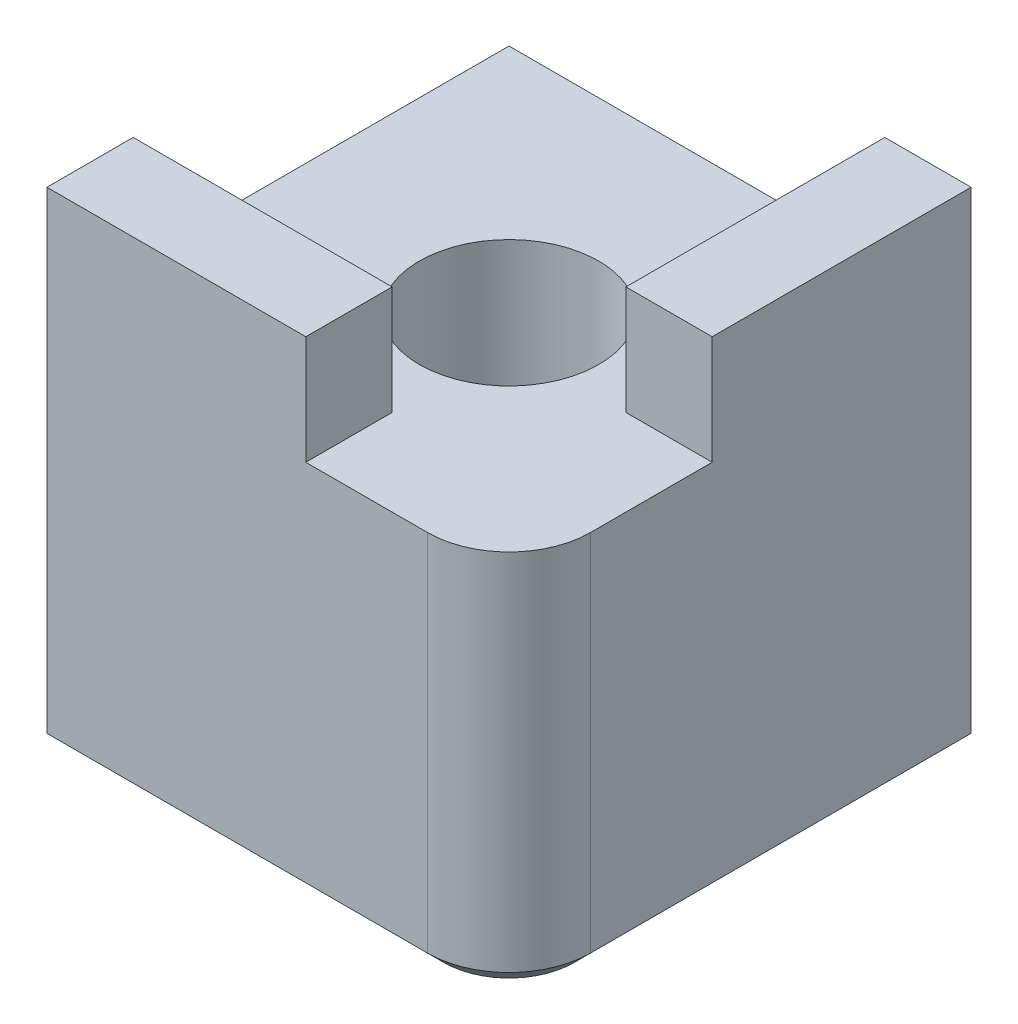
ISO-10303-21;
HEADER;
FILE_DESCRIPTION(('STEP AP214'),'2;1');
FILE_NAME('part.step','',(''),(''),'','','');
FILE_SCHEMA(('AUTOMOTIVE_DESIGN { 1 0 10303 214 1 1 1 1 }'));
ENDSEC;
DATA;
#1=APPLICATION_CONTEXT('core data for automotive mechanical design processes');
#2=APPLICATION_PROTOCOL_DEFINITION('international standard','automotive_design',2000,#1);
#3=PRODUCT_CONTEXT('',#1,'mechanical');
#4=PRODUCT('Part','Part','',(#3));
#5=PRODUCT_RELATED_PRODUCT_CATEGORY('part','',(#4));
#6=PRODUCT_DEFINITION_FORMATION('','',#4);
#7=PRODUCT_DEFINITION_CONTEXT('part definition',#1,'design');
#8=PRODUCT_DEFINITION('design','',#6,#7);
#9=PRODUCT_DEFINITION_SHAPE('','',#8);
#10=(LENGTH_UNIT() NAMED_UNIT(*) SI_UNIT(.MILLI.,.METRE.));
#11=(NAMED_UNIT(*) PLANE_ANGLE_UNIT() SI_UNIT($,.RADIAN.));
#12=(NAMED_UNIT(*) SI_UNIT($,.STERADIAN.) SOLID_ANGLE_UNIT());
#13=UNCERTAINTY_MEASURE_WITH_UNIT(LENGTH_MEASURE(1.E-05),#10,'distance_accuracy_value','');
#14=(GEOMETRIC_REPRESENTATION_CONTEXT(3) GLOBAL_UNCERTAINTY_ASSIGNED_CONTEXT((#13)) GLOBAL_UNIT_ASSIGNED_CONTEXT((#10,
#11,#12)) REPRESENTATION_CONTEXT('',''));
#15=CARTESIAN_POINT('',(0.,0.,0.));
#16=DIRECTION('',(0.,0.,1.));
#17=DIRECTION('',(1.,0.,0.));
#18=AXIS2_PLACEMENT_3D('',#15,#16,#17);
#19=CARTESIAN_POINT('',(0.,-1.5,0.));
#20=DIRECTION('',(0.,1.,0.));
#21=DIRECTION('',(0.,0.,1.));
#22=AXIS2_PLACEMENT_3D('',#19,#20,#21);
#23=PLANE('',#22);
#24=CARTESIAN_POINT('',(0.,-1.5,0.));
#25=DIRECTION('',(0.,1.,0.));
#26=DIRECTION('',(0.,0.,1.));
#27=AXIS2_PLACEMENT_3D('',#24,#25,#26);
#28=CIRCLE('',#27,1.65);
#29=CARTESIAN_POINT('',(0.,-1.5,1.65));
#30=VERTEX_POINT('',#29);
#31=EDGE_CURVE('E242',#30,#30,#28,.T.);
#32=ORIENTED_EDGE('',*,*,#31,.F.);
#33=EDGE_LOOP('',(#32));
#34=FACE_BOUND('',#33,.T.);
#35=DIRECTION('',(-1.,0.,0.));
#36=VECTOR('',#35,1.);
#37=CARTESIAN_POINT('',(-4.25,-1.5,2.6625));
#38=LINE('',#37,#36);
#39=CARTESIAN_POINT('',(0.512500000000001,-1.5,2.6625));
#40=VERTEX_POINT('',#39);
#41=CARTESIAN_POINT('',(-4.25,-1.5,2.6625));
#42=VERTEX_POINT('',#41);
#43=EDGE_CURVE('E191',#40,#42,#38,.T.);
#44=ORIENTED_EDGE('',*,*,#43,.F.);
#45=DIRECTION('',(0.,0.,-1.));
#46=VECTOR('',#45,1.);
#47=CARTESIAN_POINT('',(0.512500000000001,-1.5,4.25));
#48=LINE('',#47,#46);
#49=CARTESIAN_POINT('',(0.512500000000001,-1.5,4.25));
#50=VERTEX_POINT('',#49);
#51=EDGE_CURVE('E194',#50,#40,#48,.T.);
#52=ORIENTED_EDGE('',*,*,#51,.F.);
#53=DIRECTION('',(1.,0.,0.));
#54=VECTOR('',#53,1.);
#55=CARTESIAN_POINT('',(-4.25,-1.5,4.25));
#56=LINE('',#55,#54);
#57=CARTESIAN_POINT('',(2.75,-1.5,4.25));
#58=VERTEX_POINT('',#57);
#59=EDGE_CURVE('E250',#50,#58,#56,.T.);
#60=ORIENTED_EDGE('',*,*,#59,.T.);
#61=CARTESIAN_POINT('',(2.75,-1.5,2.75));
#62=DIRECTION('',(0.,1.,0.));
#63=DIRECTION('',(0.,0.,1.));
#64=AXIS2_PLACEMENT_3D('',#61,#62,#63);
#65=CIRCLE('',#64,1.5);
#66=CARTESIAN_POINT('',(4.25,-1.5,2.75));
#67=VERTEX_POINT('',#66);
#68=EDGE_CURVE('E238',#67,#58,#65,.F.);
#69=ORIENTED_EDGE('',*,*,#68,.F.);
#70=DIRECTION('',(0.,0.,1.));
#71=VECTOR('',#70,1.);
#72=CARTESIAN_POINT('',(4.25,-1.5,-4.25));
#73=LINE('',#72,#71);
#74=CARTESIAN_POINT('',(4.25,-1.5,0.512500000000001));
#75=VERTEX_POINT('',#74);
#76=EDGE_CURVE('E253',#75,#67,#73,.T.);
#77=ORIENTED_EDGE('',*,*,#76,.F.);
#78=DIRECTION('',(1.,0.,0.));
#79=VECTOR('',#78,1.);
#80=CARTESIAN_POINT('',(4.25,-1.5,0.512500000000001));
#81=LINE('',#80,#79);
#82=CARTESIAN_POINT('',(2.6625,-1.5,0.512500000000001));
#83=VERTEX_POINT('',#82);
#84=EDGE_CURVE('E213',#83,#75,#81,.T.);
#85=ORIENTED_EDGE('',*,*,#84,.F.);
#86=DIRECTION('',(0.,0.,1.));
#87=VECTOR('',#86,1.);
#88=CARTESIAN_POINT('',(2.6625,-1.5,-4.25));
#89=LINE('',#88,#87);
#90=CARTESIAN_POINT('',(2.6625,-1.5,-4.25));
#91=VERTEX_POINT('',#90);
#92=EDGE_CURVE('E74',#91,#83,#89,.T.);
#93=ORIENTED_EDGE('',*,*,#92,.F.);
#94=DIRECTION('',(-1.,0.,0.));
#95=VECTOR('',#94,1.);
#96=CARTESIAN_POINT('',(-4.25,-1.5,-4.25));
#97=LINE('',#96,#95);
#98=CARTESIAN_POINT('',(-4.25,-1.5,-4.25));
#99=VERTEX_POINT('',#98);
#100=EDGE_CURVE('E260',#91,#99,#97,.T.);
#101=ORIENTED_EDGE('',*,*,#100,.T.);
#102=DIRECTION('',(0.,0.,1.));
#103=VECTOR('',#102,1.);
#104=CARTESIAN_POINT('',(-4.25,-1.5,-4.25));
#105=LINE('',#104,#103);
#106=EDGE_CURVE('E256',#99,#42,#105,.T.);
#107=ORIENTED_EDGE('',*,*,#106,.T.);
#108=EDGE_LOOP('',(#44,#52,#60,#69,#77,#85,#93,#101,#107));
#109=FACE_BOUND('',#108,.T.);
#110=ADVANCED_FACE('F42',(#34,#109),#23,.T.);
#111=CARTESIAN_POINT('',(-4.25,-8.5,4.25));
#112=DIRECTION('',(0.,0.,1.));
#113=DIRECTION('',(1.,0.,0.));
#114=AXIS2_PLACEMENT_3D('',#111,#112,#113);
#115=PLANE('',#114);
#116=DIRECTION('',(0.,1.,0.));
#117=VECTOR('',#116,1.);
#118=CARTESIAN_POINT('',(-4.25,-8.5,4.25));
#119=LINE('',#118,#117);
#120=CARTESIAN_POINT('',(-4.25,-8.2,4.25));
#121=VERTEX_POINT('',#120);
#122=CARTESIAN_POINT('',(-4.25,0.5,4.25));
#123=VERTEX_POINT('',#122);
#124=EDGE_CURVE('E165',#121,#123,#119,.T.);
#125=ORIENTED_EDGE('',*,*,#124,.F.);
#126=DIRECTION('',(1.,0.,0.));
#127=VECTOR('',#126,1.);
#128=CARTESIAN_POINT('',(-4.25,-8.2,4.25));
#129=LINE('',#128,#127);
#130=CARTESIAN_POINT('',(2.75,-8.2,4.25));
#131=VERTEX_POINT('',#130);
#132=EDGE_CURVE('E52',#121,#131,#129,.T.);
#133=ORIENTED_EDGE('',*,*,#132,.T.);
#134=DIRECTION('',(0.,1.,0.));
#135=VECTOR('',#134,1.);
#136=CARTESIAN_POINT('',(2.75,-8.5,4.25));
#137=LINE('',#136,#135);
#138=EDGE_CURVE('E175',#131,#58,#137,.T.);
#139=ORIENTED_EDGE('',*,*,#138,.T.);
#140=ORIENTED_EDGE('',*,*,#59,.F.);
#141=DIRECTION('',(0.,-1.,0.));
#142=VECTOR('',#141,1.);
#143=CARTESIAN_POINT('',(0.512500000000001,0.5,4.25));
#144=LINE('',#143,#142);
#145=CARTESIAN_POINT('',(0.512500000000001,0.5,4.25));
#146=VERTEX_POINT('',#145);
#147=EDGE_CURVE('E182',#146,#50,#144,.T.);
#148=ORIENTED_EDGE('',*,*,#147,.F.);
#149=DIRECTION('',(1.,0.,0.));
#150=VECTOR('',#149,1.);
#151=CARTESIAN_POINT('',(-4.25,0.5,4.25));
#152=LINE('',#151,#150);
#153=EDGE_CURVE('E179',#123,#146,#152,.T.);
#154=ORIENTED_EDGE('',*,*,#153,.F.);
#155=EDGE_LOOP('',(#125,#133,#139,#140,#148,#154));
#156=FACE_BOUND('',#155,.T.);
#157=ADVANCED_FACE('F180',(#156),#115,.T.);
#158=CARTESIAN_POINT('',(4.25,-8.5,4.25));
#159=DIRECTION('',(1.,0.,0.));
#160=DIRECTION('',(0.,0.,-1.));
#161=AXIS2_PLACEMENT_3D('',#158,#159,#160);
#162=PLANE('',#161);
#163=DIRECTION('',(0.,1.,0.));
#164=VECTOR('',#163,1.);
#165=CARTESIAN_POINT('',(4.25,-8.5,2.75));
#166=LINE('',#165,#164);
#167=CARTESIAN_POINT('',(4.25,-8.2,2.75));
#168=VERTEX_POINT('',#167);
#169=EDGE_CURVE('E272',#67,#168,#166,.F.);
#170=ORIENTED_EDGE('',*,*,#169,.T.);
#171=DIRECTION('',(0.,0.,-1.));
#172=VECTOR('',#171,1.);
#173=CARTESIAN_POINT('',(4.25,-8.2,4.25));
#174=LINE('',#173,#172);
#175=CARTESIAN_POINT('',(4.25,-8.2,-4.25));
#176=VERTEX_POINT('',#175);
#177=EDGE_CURVE('E297',#168,#176,#174,.T.);
#178=ORIENTED_EDGE('',*,*,#177,.T.);
#179=DIRECTION('',(0.,1.,0.));
#180=VECTOR('',#179,1.);
#181=CARTESIAN_POINT('',(4.25,-8.5,-4.25));
#182=LINE('',#181,#180);
#183=CARTESIAN_POINT('',(4.25,0.5,-4.25));
#184=VERTEX_POINT('',#183);
#185=EDGE_CURVE('E262',#176,#184,#182,.T.);
#186=ORIENTED_EDGE('',*,*,#185,.T.);
#187=DIRECTION('',(0.,0.,-1.));
#188=VECTOR('',#187,1.);
#189=CARTESIAN_POINT('',(4.25,0.5,-4.25));
#190=LINE('',#189,#188);
#191=CARTESIAN_POINT('',(4.25,0.5,0.512500000000001));
#192=VERTEX_POINT('',#191);
#193=EDGE_CURVE('E209',#192,#184,#190,.T.);
#194=ORIENTED_EDGE('',*,*,#193,.F.);
#195=DIRECTION('',(0.,-1.,0.));
#196=VECTOR('',#195,1.);
#197=CARTESIAN_POINT('',(4.25,0.5,0.512500000000001));
#198=LINE('',#197,#196);
#199=EDGE_CURVE('E221',#192,#75,#198,.T.);
#200=ORIENTED_EDGE('',*,*,#199,.T.);
#201=ORIENTED_EDGE('',*,*,#76,.T.);
#202=EDGE_LOOP('',(#170,#178,#186,#194,#200,#201));
#203=FACE_BOUND('',#202,.T.);
#204=ADVANCED_FACE('F329',(#203),#162,.T.);
#205=CARTESIAN_POINT('',(2.75,-8.5,2.75));
#206=DIRECTION('',(0.,1.,0.));
#207=DIRECTION('',(0.,0.,1.));
#208=AXIS2_PLACEMENT_3D('',#205,#206,#207);
#209=CYLINDRICAL_SURFACE('',#208,1.5);
#210=ORIENTED_EDGE('',*,*,#138,.F.);
#211=CARTESIAN_POINT('',(2.75,-8.2,2.75));
#212=DIRECTION('',(0.,-1.,0.));
#213=DIRECTION('',(0.,0.,-1.));
#214=AXIS2_PLACEMENT_3D('',#211,#212,#213);
#215=CIRCLE('',#214,1.5);
#216=EDGE_CURVE('E11',#131,#168,#215,.F.);
#217=ORIENTED_EDGE('',*,*,#216,.T.);
#218=ORIENTED_EDGE('',*,*,#169,.F.);
#219=ORIENTED_EDGE('',*,*,#68,.T.);
#220=EDGE_LOOP('',(#210,#217,#218,#219));
#221=FACE_BOUND('',#220,.T.);
#222=ADVANCED_FACE('F377',(#221),#209,.T.);
#223=CARTESIAN_POINT('',(-4.25,-8.5,4.25));
#224=DIRECTION('',(-1.,0.,0.));
#225=DIRECTION('',(0.,0.,1.));
#226=AXIS2_PLACEMENT_3D('',#223,#224,#225);
#227=PLANE('',#226);
#228=DIRECTION('',(0.,1.,0.));
#229=VECTOR('',#228,1.);
#230=CARTESIAN_POINT('',(-4.25,-8.5,-4.25));
#231=LINE('',#230,#229);
#232=CARTESIAN_POINT('',(-4.25,-8.2,-4.25));
#233=VERTEX_POINT('',#232);
#234=EDGE_CURVE('E176',#233,#99,#231,.T.);
#235=ORIENTED_EDGE('',*,*,#234,.F.);
#236=DIRECTION('',(0.,0.,1.));
#237=VECTOR('',#236,1.);
#238=CARTESIAN_POINT('',(-4.25,-8.2,4.25));
#239=LINE('',#238,#237);
#240=EDGE_CURVE('E173',#233,#121,#239,.T.);
#241=ORIENTED_EDGE('',*,*,#240,.T.);
#242=ORIENTED_EDGE('',*,*,#124,.T.);
#243=DIRECTION('',(0.,0.,1.));
#244=VECTOR('',#243,1.);
#245=CARTESIAN_POINT('',(-4.25,0.5,4.25));
#246=LINE('',#245,#244);
#247=CARTESIAN_POINT('',(-4.25,0.5,2.6625));
#248=VERTEX_POINT('',#247);
#249=EDGE_CURVE('E171',#248,#123,#246,.T.);
#250=ORIENTED_EDGE('',*,*,#249,.F.);
#251=DIRECTION('',(0.,-1.,0.));
#252=VECTOR('',#251,1.);
#253=CARTESIAN_POINT('',(-4.25,0.5,2.6625));
#254=LINE('',#253,#252);
#255=EDGE_CURVE('E201',#248,#42,#254,.T.);
#256=ORIENTED_EDGE('',*,*,#255,.T.);
#257=ORIENTED_EDGE('',*,*,#106,.F.);
#258=EDGE_LOOP('',(#235,#241,#242,#250,#256,#257));
#259=FACE_BOUND('',#258,.T.);
#260=ADVANCED_FACE('F168',(#259),#227,.T.);
#261=CARTESIAN_POINT('',(-4.25,-8.5,-4.25));
#262=DIRECTION('',(0.,0.,-1.));
#263=DIRECTION('',(-1.,0.,0.));
#264=AXIS2_PLACEMENT_3D('',#261,#262,#263);
#265=PLANE('',#264);
#266=ORIENTED_EDGE('',*,*,#185,.F.);
#267=DIRECTION('',(-1.,0.,0.));
#268=VECTOR('',#267,1.);
#269=CARTESIAN_POINT('',(-4.25,-8.2,-4.25));
#270=LINE('',#269,#268);
#271=EDGE_CURVE('E294',#176,#233,#270,.T.);
#272=ORIENTED_EDGE('',*,*,#271,.T.);
#273=ORIENTED_EDGE('',*,*,#234,.T.);
#274=ORIENTED_EDGE('',*,*,#100,.F.);
#275=DIRECTION('',(0.,-1.,0.));
#276=VECTOR('',#275,1.);
#277=CARTESIAN_POINT('',(2.6625,0.5,-4.25));
#278=LINE('',#277,#276);
#279=CARTESIAN_POINT('',(2.6625,0.5,-4.25));
#280=VERTEX_POINT('',#279);
#281=EDGE_CURVE('E233',#280,#91,#278,.T.);
#282=ORIENTED_EDGE('',*,*,#281,.F.);
#283=DIRECTION('',(-1.,0.,0.));
#284=VECTOR('',#283,1.);
#285=CARTESIAN_POINT('',(4.25,0.5,-4.25));
#286=LINE('',#285,#284);
#287=EDGE_CURVE('E212',#184,#280,#286,.T.);
#288=ORIENTED_EDGE('',*,*,#287,.F.);
#289=EDGE_LOOP('',(#266,#272,#273,#274,#282,#288));
#290=FACE_BOUND('',#289,.T.);
#291=ADVANCED_FACE('F334',(#290),#265,.T.);
#292=CARTESIAN_POINT('',(0.,-8.5,0.));
#293=DIRECTION('',(0.,-1.,0.));
#294=DIRECTION('',(0.,0.,-1.));
#295=AXIS2_PLACEMENT_3D('',#292,#293,#294);
#296=PLANE('',#295);
#297=DIRECTION('',(-1.,0.,0.));
#298=VECTOR('',#297,1.);
#299=CARTESIAN_POINT('',(0.,-8.5,3.95));
#300=LINE('',#299,#298);
#301=CARTESIAN_POINT('',(2.75,-8.5,3.95));
#302=VERTEX_POINT('',#301);
#303=CARTESIAN_POINT('',(-3.95,-8.5,3.95));
#304=VERTEX_POINT('',#303);
#305=EDGE_CURVE('E281',#302,#304,#300,.T.);
#306=ORIENTED_EDGE('',*,*,#305,.T.);
#307=DIRECTION('',(0.,0.,-1.));
#308=VECTOR('',#307,1.);
#309=CARTESIAN_POINT('',(-3.95,-8.5,0.));
#310=LINE('',#309,#308);
#311=CARTESIAN_POINT('',(-3.95,-8.5,-3.95));
#312=VERTEX_POINT('',#311);
#313=EDGE_CURVE('E290',#304,#312,#310,.T.);
#314=ORIENTED_EDGE('',*,*,#313,.T.);
#315=DIRECTION('',(1.,0.,0.));
#316=VECTOR('',#315,1.);
#317=CARTESIAN_POINT('',(0.,-8.5,-3.95));
#318=LINE('',#317,#316);
#319=CARTESIAN_POINT('',(3.95,-8.5,-3.95));
#320=VERTEX_POINT('',#319);
#321=EDGE_CURVE('E287',#312,#320,#318,.T.);
#322=ORIENTED_EDGE('',*,*,#321,.T.);
#323=DIRECTION('',(0.,0.,1.));
#324=VECTOR('',#323,1.);
#325=CARTESIAN_POINT('',(3.95,-8.5,0.));
#326=LINE('',#325,#324);
#327=CARTESIAN_POINT('',(3.95,-8.5,2.75));
#328=VERTEX_POINT('',#327);
#329=EDGE_CURVE('E284',#320,#328,#326,.T.);
#330=ORIENTED_EDGE('',*,*,#329,.T.);
#331=CARTESIAN_POINT('',(2.75,-8.5,2.75));
#332=DIRECTION('',(0.,-1.,0.));
#333=DIRECTION('',(0.,0.,-1.));
#334=AXIS2_PLACEMENT_3D('',#331,#332,#333);
#335=CIRCLE('',#334,1.2);
#336=EDGE_CURVE('E278',#328,#302,#335,.T.);
#337=ORIENTED_EDGE('',*,*,#336,.T.);
#338=EDGE_LOOP('',(#306,#314,#322,#330,#337));
#339=FACE_BOUND('',#338,.T.);
#340=ADVANCED_FACE('F371',(#339),#296,.T.);
#341=CARTESIAN_POINT('',(0.,-6.5,0.));
#342=DIRECTION('',(0.,1.,0.));
#343=DIRECTION('',(0.,0.,1.));
#344=AXIS2_PLACEMENT_3D('',#341,#342,#343);
#345=CONICAL_SURFACE('',#344,1.65,1.02974425867665);
#346=CARTESIAN_POINT('',(0.,-7.49142002139547,0.));
#347=VERTEX_POINT('',#346);
#348=VERTEX_LOOP('',#347);
#349=FACE_BOUND('',#348,.T.);
#350=CARTESIAN_POINT('',(0.,-6.5,0.));
#351=DIRECTION('',(0.,1.,0.));
#352=DIRECTION('',(0.,0.,1.));
#353=AXIS2_PLACEMENT_3D('',#350,#351,#352);
#354=CIRCLE('',#353,1.65);
#355=CARTESIAN_POINT('',(0.,-6.5,1.65));
#356=VERTEX_POINT('',#355);
#357=EDGE_CURVE('E246',#356,#356,#354,.T.);
#358=ORIENTED_EDGE('',*,*,#357,.T.);
#359=EDGE_LOOP('',(#358));
#360=FACE_BOUND('',#359,.T.);
#361=ADVANCED_FACE('F370',(#349,#360),#345,.F.);
#362=CARTESIAN_POINT('',(0.,-1.5,0.));
#363=DIRECTION('',(0.,1.,0.));
#364=DIRECTION('',(0.,0.,1.));
#365=AXIS2_PLACEMENT_3D('',#362,#363,#364);
#366=CYLINDRICAL_SURFACE('',#365,1.65);
#367=ORIENTED_EDGE('',*,*,#357,.F.);
#368=EDGE_LOOP('',(#367));
#369=FACE_BOUND('',#368,.T.);
#370=ORIENTED_EDGE('',*,*,#31,.T.);
#371=EDGE_LOOP('',(#370));
#372=FACE_BOUND('',#371,.T.);
#373=ADVANCED_FACE('F394',(#369,#372),#366,.F.);
#374=CARTESIAN_POINT('',(4.25,-8.2,4.25));
#375=DIRECTION('',(-0.707106781186548,0.707106781186546,0.));
#376=DIRECTION('',(0.,0.,-1.));
#377=AXIS2_PLACEMENT_3D('',#374,#375,#376);
#378=PLANE('',#377);
#379=DIRECTION('',(0.577350269189623,0.577350269189624,-0.577350269189631));
#380=VECTOR('',#379,1.);
#381=CARTESIAN_POINT('',(1.41666666666666,-11.0333333333334,-1.41666666666662));
#382=LINE('',#381,#380);
#383=EDGE_CURVE('E309',#176,#320,#382,.F.);
#384=ORIENTED_EDGE('',*,*,#383,.F.);
#385=ORIENTED_EDGE('',*,*,#177,.F.);
#386=DIRECTION('',(0.707106781186546,0.707106781186548,0.));
#387=VECTOR('',#386,1.);
#388=CARTESIAN_POINT('',(3.95,-8.5,2.75));
#389=LINE('',#388,#387);
#390=EDGE_CURVE('E46',#328,#168,#389,.T.);
#391=ORIENTED_EDGE('',*,*,#390,.F.);
#392=ORIENTED_EDGE('',*,*,#329,.F.);
#393=EDGE_LOOP('',(#384,#385,#391,#392));
#394=FACE_BOUND('',#393,.T.);
#395=ADVANCED_FACE('F44',(#394),#378,.F.);
#396=CARTESIAN_POINT('',(2.75,-8.5,2.75));
#397=DIRECTION('',(0.,1.,0.));
#398=DIRECTION('',(0.,0.,1.));
#399=AXIS2_PLACEMENT_3D('',#396,#397,#398);
#400=CONICAL_SURFACE('',#399,1.2,0.785398163397448);
#401=ORIENTED_EDGE('',*,*,#390,.T.);
#402=ORIENTED_EDGE('',*,*,#216,.F.);
#403=DIRECTION('',(0.,0.707106781186548,0.707106781186546));
#404=VECTOR('',#403,1.);
#405=CARTESIAN_POINT('',(2.75,-8.5,3.95));
#406=LINE('',#405,#404);
#407=EDGE_CURVE('E306',#302,#131,#406,.T.);
#408=ORIENTED_EDGE('',*,*,#407,.F.);
#409=ORIENTED_EDGE('',*,*,#336,.F.);
#410=EDGE_LOOP('',(#401,#402,#408,#409));
#411=FACE_BOUND('',#410,.T.);
#412=ADVANCED_FACE('F322',(#411),#400,.T.);
#413=CARTESIAN_POINT('',(-4.25,-8.2,-4.25));
#414=DIRECTION('',(0.,0.707106781186552,0.707106781186544));
#415=DIRECTION('',(-1.,0.,0.));
#416=AXIS2_PLACEMENT_3D('',#413,#414,#415);
#417=PLANE('',#416);
#418=ORIENTED_EDGE('',*,*,#383,.T.);
#419=ORIENTED_EDGE('',*,*,#321,.F.);
#420=DIRECTION('',(-0.577350269189628,0.577350269189621,-0.577350269189628));
#421=VECTOR('',#420,1.);
#422=CARTESIAN_POINT('',(-4.25,-8.2,-4.25));
#423=LINE('',#422,#421);
#424=EDGE_CURVE('E303',#233,#312,#423,.F.);
#425=ORIENTED_EDGE('',*,*,#424,.F.);
#426=ORIENTED_EDGE('',*,*,#271,.F.);
#427=EDGE_LOOP('',(#418,#419,#425,#426));
#428=FACE_BOUND('',#427,.T.);
#429=ADVANCED_FACE('F387',(#428),#417,.F.);
#430=CARTESIAN_POINT('',(-4.25,-8.2,4.25));
#431=DIRECTION('',(0.,0.707106781186546,-0.707106781186548));
#432=DIRECTION('',(1.,0.,0.));
#433=AXIS2_PLACEMENT_3D('',#430,#431,#432);
#434=PLANE('',#433);
#435=ORIENTED_EDGE('',*,*,#407,.T.);
#436=ORIENTED_EDGE('',*,*,#132,.F.);
#437=DIRECTION('',(0.577350269189631,-0.577350269189624,-0.577350269189623));
#438=VECTOR('',#437,1.);
#439=CARTESIAN_POINT('',(-4.25,-8.2,4.25));
#440=LINE('',#439,#438);
#441=EDGE_CURVE('E237',#304,#121,#440,.F.);
#442=ORIENTED_EDGE('',*,*,#441,.F.);
#443=ORIENTED_EDGE('',*,*,#305,.F.);
#444=EDGE_LOOP('',(#435,#436,#442,#443));
#445=FACE_BOUND('',#444,.T.);
#446=ADVANCED_FACE('F356',(#445),#434,.F.);
#447=CARTESIAN_POINT('',(-4.25,-8.2,4.25));
#448=DIRECTION('',(0.707106781186544,0.707106781186552,0.));
#449=DIRECTION('',(0.,0.,1.));
#450=AXIS2_PLACEMENT_3D('',#447,#448,#449);
#451=PLANE('',#450);
#452=ORIENTED_EDGE('',*,*,#424,.T.);
#453=ORIENTED_EDGE('',*,*,#313,.F.);
#454=ORIENTED_EDGE('',*,*,#441,.T.);
#455=ORIENTED_EDGE('',*,*,#240,.F.);
#456=EDGE_LOOP('',(#452,#453,#454,#455));
#457=FACE_BOUND('',#456,.T.);
#458=ADVANCED_FACE('F349',(#457),#451,.F.);
#459=CARTESIAN_POINT('',(2.6625,0.5,-4.25));
#460=DIRECTION('',(1.,0.,0.));
#461=DIRECTION('',(0.,0.,-1.));
#462=AXIS2_PLACEMENT_3D('',#459,#460,#461);
#463=PLANE('',#462);
#464=ORIENTED_EDGE('',*,*,#92,.T.);
#465=DIRECTION('',(0.,-1.,0.));
#466=VECTOR('',#465,1.);
#467=CARTESIAN_POINT('',(2.6625,0.5,0.512500000000001));
#468=LINE('',#467,#466);
#469=CARTESIAN_POINT('',(2.6625,0.5,0.512500000000001));
#470=VERTEX_POINT('',#469);
#471=EDGE_CURVE('E229',#470,#83,#468,.T.);
#472=ORIENTED_EDGE('',*,*,#471,.F.);
#473=DIRECTION('',(0.,0.,1.));
#474=VECTOR('',#473,1.);
#475=CARTESIAN_POINT('',(2.6625,0.5,-4.25));
#476=LINE('',#475,#474);
#477=EDGE_CURVE('E215',#280,#470,#476,.T.);
#478=ORIENTED_EDGE('',*,*,#477,.F.);
#479=ORIENTED_EDGE('',*,*,#281,.T.);
#480=EDGE_LOOP('',(#464,#472,#478,#479));
#481=FACE_BOUND('',#480,.T.);
#482=ADVANCED_FACE('F347',(#481),#463,.F.);
#483=CARTESIAN_POINT('',(4.25,0.5,0.512500000000001));
#484=DIRECTION('',(0.,0.,-1.));
#485=DIRECTION('',(-1.,0.,0.));
#486=AXIS2_PLACEMENT_3D('',#483,#484,#485);
#487=PLANE('',#486);
#488=ORIENTED_EDGE('',*,*,#84,.T.);
#489=ORIENTED_EDGE('',*,*,#199,.F.);
#490=DIRECTION('',(1.,0.,0.));
#491=VECTOR('',#490,1.);
#492=CARTESIAN_POINT('',(4.25,0.5,0.512500000000001));
#493=LINE('',#492,#491);
#494=EDGE_CURVE('E218',#470,#192,#493,.T.);
#495=ORIENTED_EDGE('',*,*,#494,.F.);
#496=ORIENTED_EDGE('',*,*,#471,.T.);
#497=EDGE_LOOP('',(#488,#489,#495,#496));
#498=FACE_BOUND('',#497,.T.);
#499=ADVANCED_FACE('F343',(#498),#487,.F.);
#500=CARTESIAN_POINT('',(0.,0.5,0.));
#501=DIRECTION('',(0.,-1.,0.));
#502=DIRECTION('',(0.,0.,-1.));
#503=AXIS2_PLACEMENT_3D('',#500,#501,#502);
#504=PLANE('',#503);
#505=ORIENTED_EDGE('',*,*,#193,.T.);
#506=ORIENTED_EDGE('',*,*,#287,.T.);
#507=ORIENTED_EDGE('',*,*,#477,.T.);
#508=ORIENTED_EDGE('',*,*,#494,.T.);
#509=EDGE_LOOP('',(#505,#506,#507,#508));
#510=FACE_BOUND('',#509,.T.);
#511=ADVANCED_FACE('F338',(#510),#504,.F.);
#512=CARTESIAN_POINT('',(0.512500000000001,0.5,4.25));
#513=DIRECTION('',(-1.,0.,0.));
#514=DIRECTION('',(0.,0.,1.));
#515=AXIS2_PLACEMENT_3D('',#512,#513,#514);
#516=PLANE('',#515);
#517=ORIENTED_EDGE('',*,*,#51,.T.);
#518=DIRECTION('',(0.,-1.,0.));
#519=VECTOR('',#518,1.);
#520=CARTESIAN_POINT('',(0.512500000000001,0.5,2.6625));
#521=LINE('',#520,#519);
#522=CARTESIAN_POINT('',(0.512500000000001,0.5,2.6625));
#523=VERTEX_POINT('',#522);
#524=EDGE_CURVE('E63',#523,#40,#521,.T.);
#525=ORIENTED_EDGE('',*,*,#524,.F.);
#526=DIRECTION('',(0.,0.,-1.));
#527=VECTOR('',#526,1.);
#528=CARTESIAN_POINT('',(0.512500000000001,0.5,4.25));
#529=LINE('',#528,#527);
#530=EDGE_CURVE('E186',#146,#523,#529,.T.);
#531=ORIENTED_EDGE('',*,*,#530,.F.);
#532=ORIENTED_EDGE('',*,*,#147,.T.);
#533=EDGE_LOOP('',(#517,#525,#531,#532));
#534=FACE_BOUND('',#533,.T.);
#535=ADVANCED_FACE('F530',(#534),#516,.F.);
#536=CARTESIAN_POINT('',(-4.25,0.5,2.6625));
#537=DIRECTION('',(0.,0.,1.));
#538=DIRECTION('',(1.,0.,0.));
#539=AXIS2_PLACEMENT_3D('',#536,#537,#538);
#540=PLANE('',#539);
#541=ORIENTED_EDGE('',*,*,#43,.T.);
#542=ORIENTED_EDGE('',*,*,#255,.F.);
#543=DIRECTION('',(-1.,0.,0.));
#544=VECTOR('',#543,1.);
#545=CARTESIAN_POINT('',(-4.25,0.5,2.6625));
#546=LINE('',#545,#544);
#547=EDGE_CURVE('E189',#523,#248,#546,.T.);
#548=ORIENTED_EDGE('',*,*,#547,.F.);
#549=ORIENTED_EDGE('',*,*,#524,.T.);
#550=EDGE_LOOP('',(#541,#542,#548,#549));
#551=FACE_BOUND('',#550,.T.);
#552=ADVANCED_FACE('F538',(#551),#540,.F.);
#553=CARTESIAN_POINT('',(0.,0.5,0.));
#554=DIRECTION('',(0.,-1.,0.));
#555=DIRECTION('',(0.,0.,-1.));
#556=AXIS2_PLACEMENT_3D('',#553,#554,#555);
#557=PLANE('',#556);
#558=ORIENTED_EDGE('',*,*,#249,.T.);
#559=ORIENTED_EDGE('',*,*,#153,.T.);
#560=ORIENTED_EDGE('',*,*,#530,.T.);
#561=ORIENTED_EDGE('',*,*,#547,.T.);
#562=EDGE_LOOP('',(#558,#559,#560,#561));
#563=FACE_BOUND('',#562,.T.);
#564=ADVANCED_FACE('F188',(#563),#557,.F.);
#565=CLOSED_SHELL('',(#110,#157,#204,#222,#260,#291,#340,#361,#373,#395,#412,#429,#446,#458,
#482,#499,#511,#535,#552,#564));
#566=MANIFOLD_SOLID_BREP('B2',#565);
#567=ADVANCED_BREP_SHAPE_REPRESENTATION('',(#18,#566),#14);
#568=SHAPE_DEFINITION_REPRESENTATION(#9,#567);
ENDSEC;
END-ISO-10303-21;
